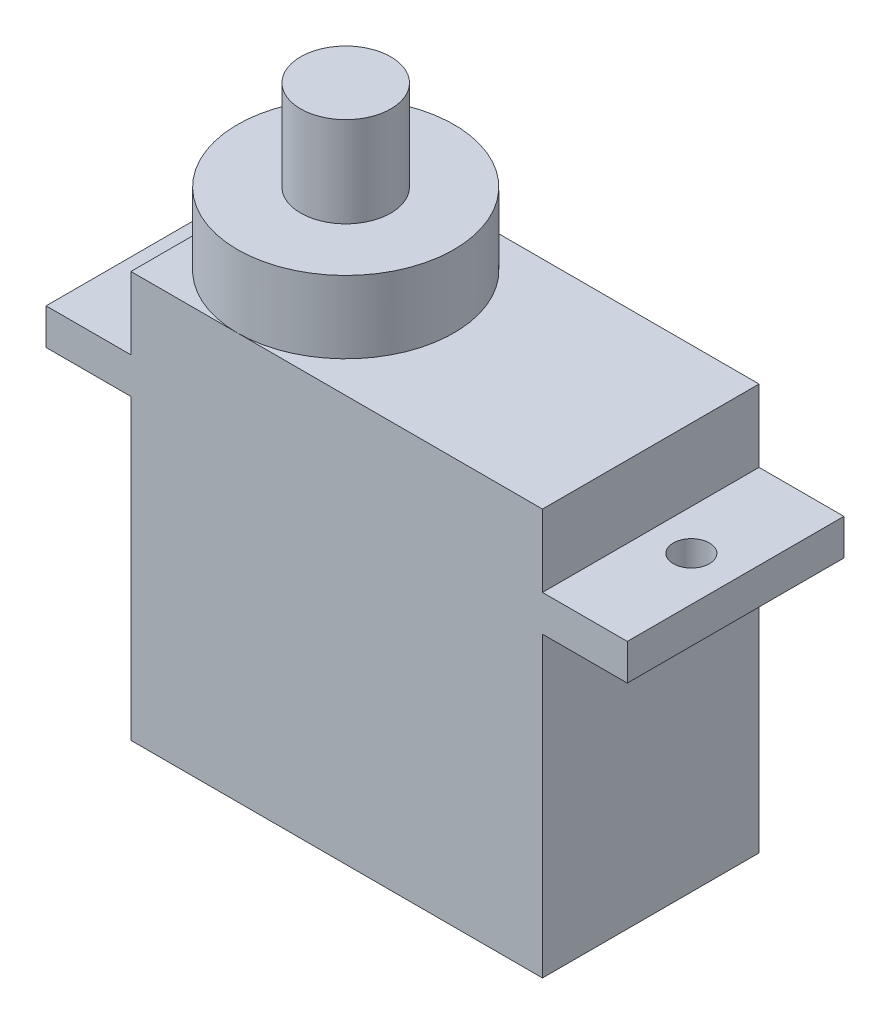
ISO-10303-21;
HEADER;
FILE_DESCRIPTION(('STEP AP214'),'2;1');
FILE_NAME('part.step','',(''),(''),'','','');
FILE_SCHEMA(('AUTOMOTIVE_DESIGN { 1 0 10303 214 1 1 1 1 }'));
ENDSEC;
DATA;
#1=APPLICATION_CONTEXT('core data for automotive mechanical design processes');
#2=APPLICATION_PROTOCOL_DEFINITION('international standard','automotive_design',2000,#1);
#3=PRODUCT_CONTEXT('',#1,'mechanical');
#4=PRODUCT('Part','Part','',(#3));
#5=PRODUCT_RELATED_PRODUCT_CATEGORY('part','',(#4));
#6=PRODUCT_DEFINITION_FORMATION('','',#4);
#7=PRODUCT_DEFINITION_CONTEXT('part definition',#1,'design');
#8=PRODUCT_DEFINITION('design','',#6,#7);
#9=PRODUCT_DEFINITION_SHAPE('','',#8);
#10=(LENGTH_UNIT() NAMED_UNIT(*) SI_UNIT(.MILLI.,.METRE.));
#11=(NAMED_UNIT(*) PLANE_ANGLE_UNIT() SI_UNIT($,.RADIAN.));
#12=(NAMED_UNIT(*) SI_UNIT($,.STERADIAN.) SOLID_ANGLE_UNIT());
#13=UNCERTAINTY_MEASURE_WITH_UNIT(LENGTH_MEASURE(1.E-05),#10,'distance_accuracy_value','');
#14=(GEOMETRIC_REPRESENTATION_CONTEXT(3) GLOBAL_UNCERTAINTY_ASSIGNED_CONTEXT((#13)) GLOBAL_UNIT_ASSIGNED_CONTEXT((#10,
#11,#12)) REPRESENTATION_CONTEXT('',''));
#15=CARTESIAN_POINT('',(0.,0.,0.));
#16=DIRECTION('',(0.,0.,1.));
#17=DIRECTION('',(1.,0.,0.));
#18=AXIS2_PLACEMENT_3D('',#15,#16,#17);
#19=CARTESIAN_POINT('',(0.,22.5,0.));
#20=DIRECTION('',(0.,-1.,0.));
#21=DIRECTION('',(0.,0.,-1.));
#22=AXIS2_PLACEMENT_3D('',#19,#20,#21);
#23=PLANE('',#22);
#24=CARTESIAN_POINT('',(-5.5,22.5,0.));
#25=DIRECTION('',(0.,1.,0.));
#26=DIRECTION('',(0.,0.,1.));
#27=AXIS2_PLACEMENT_3D('',#24,#25,#26);
#28=CIRCLE('',#27,6.);
#29=CARTESIAN_POINT('',(-5.5,22.5,-6.));
#30=VERTEX_POINT('',#29);
#31=CARTESIAN_POINT('',(-11.4,22.5,-1.09087121146357));
#32=VERTEX_POINT('',#31);
#33=EDGE_CURVE('E49',#30,#32,#28,.T.);
#34=ORIENTED_EDGE('',*,*,#33,.F.);
#35=DIRECTION('',(-1.,0.,0.));
#36=VECTOR('',#35,1.);
#37=CARTESIAN_POINT('',(-11.4,22.5,-6.));
#38=LINE('',#37,#36);
#39=CARTESIAN_POINT('',(-11.4,22.5,-6.));
#40=VERTEX_POINT('',#39);
#41=EDGE_CURVE('E262',#30,#40,#38,.T.);
#42=ORIENTED_EDGE('',*,*,#41,.T.);
#43=DIRECTION('',(0.,0.,1.));
#44=VECTOR('',#43,1.);
#45=CARTESIAN_POINT('',(-11.4,22.5,6.));
#46=LINE('',#45,#44);
#47=EDGE_CURVE('E163',#40,#32,#46,.T.);
#48=ORIENTED_EDGE('',*,*,#47,.T.);
#49=EDGE_LOOP('',(#34,#42,#48));
#50=FACE_BOUND('',#49,.T.);
#51=ADVANCED_FACE('F39',(#50),#23,.F.);
#52=CARTESIAN_POINT('',(-5.5,22.5,6.));
#53=VERTEX_POINT('',#52);
#54=EDGE_CURVE('E166',#53,#30,#28,.T.);
#55=ORIENTED_EDGE('',*,*,#54,.F.);
#56=DIRECTION('',(1.,0.,0.));
#57=VECTOR('',#56,1.);
#58=CARTESIAN_POINT('',(-11.4,22.5,6.));
#59=LINE('',#58,#57);
#60=CARTESIAN_POINT('',(11.4,22.5,6.));
#61=VERTEX_POINT('',#60);
#62=EDGE_CURVE('E151',#53,#61,#59,.T.);
#63=ORIENTED_EDGE('',*,*,#62,.T.);
#64=DIRECTION('',(0.,0.,-1.));
#65=VECTOR('',#64,1.);
#66=CARTESIAN_POINT('',(11.4,22.5,6.));
#67=LINE('',#66,#65);
#68=CARTESIAN_POINT('',(11.4,22.5,-6.));
#69=VERTEX_POINT('',#68);
#70=EDGE_CURVE('E259',#61,#69,#67,.T.);
#71=ORIENTED_EDGE('',*,*,#70,.T.);
#72=EDGE_CURVE('E168',#69,#30,#38,.T.);
#73=ORIENTED_EDGE('',*,*,#72,.T.);
#74=EDGE_LOOP('',(#55,#63,#71,#73));
#75=FACE_BOUND('',#74,.T.);
#76=ADVANCED_FACE('F167',(#75),#23,.F.);
#77=CARTESIAN_POINT('',(-11.4,22.5,6.));
#78=DIRECTION('',(1.,0.,0.));
#79=DIRECTION('',(0.,0.,-1.));
#80=AXIS2_PLACEMENT_3D('',#77,#78,#79);
#81=PLANE('',#80);
#82=DIRECTION('',(0.,-1.,0.));
#83=VECTOR('',#82,1.);
#84=CARTESIAN_POINT('',(-11.4,22.5,6.));
#85=LINE('',#84,#83);
#86=CARTESIAN_POINT('',(-11.4,16.5,6.));
#87=VERTEX_POINT('',#86);
#88=CARTESIAN_POINT('',(-11.4,0.,6.));
#89=VERTEX_POINT('',#88);
#90=EDGE_CURVE('E283',#87,#89,#85,.T.);
#91=ORIENTED_EDGE('',*,*,#90,.F.);
#92=DIRECTION('',(0.,0.,-1.));
#93=VECTOR('',#92,1.);
#94=CARTESIAN_POINT('',(-11.4,16.5,6.));
#95=LINE('',#94,#93);
#96=CARTESIAN_POINT('',(-11.4,16.5,-6.));
#97=VERTEX_POINT('',#96);
#98=EDGE_CURVE('E191',#87,#97,#95,.T.);
#99=ORIENTED_EDGE('',*,*,#98,.T.);
#100=DIRECTION('',(0.,-1.,0.));
#101=VECTOR('',#100,1.);
#102=CARTESIAN_POINT('',(-11.4,22.5,-6.));
#103=LINE('',#102,#101);
#104=CARTESIAN_POINT('',(-11.4,0.,-6.));
#105=VERTEX_POINT('',#104);
#106=EDGE_CURVE('E287',#97,#105,#103,.T.);
#107=ORIENTED_EDGE('',*,*,#106,.T.);
#108=DIRECTION('',(0.,0.,1.));
#109=VECTOR('',#108,1.);
#110=CARTESIAN_POINT('',(-11.4,0.,6.));
#111=LINE('',#110,#109);
#112=EDGE_CURVE('E275',#105,#89,#111,.T.);
#113=ORIENTED_EDGE('',*,*,#112,.T.);
#114=EDGE_LOOP('',(#91,#99,#107,#113));
#115=FACE_BOUND('',#114,.T.);
#116=ADVANCED_FACE('F297',(#115),#81,.F.);
#117=CARTESIAN_POINT('',(11.4,22.5,6.));
#118=DIRECTION('',(-1.,0.,0.));
#119=DIRECTION('',(0.,0.,1.));
#120=AXIS2_PLACEMENT_3D('',#117,#118,#119);
#121=PLANE('',#120);
#122=DIRECTION('',(0.,0.,1.));
#123=VECTOR('',#122,1.);
#124=CARTESIAN_POINT('',(11.4,18.5,6.));
#125=LINE('',#124,#123);
#126=CARTESIAN_POINT('',(11.4,18.5,-6.));
#127=VERTEX_POINT('',#126);
#128=CARTESIAN_POINT('',(11.4,18.5,6.));
#129=VERTEX_POINT('',#128);
#130=EDGE_CURVE('E228',#127,#129,#125,.T.);
#131=ORIENTED_EDGE('',*,*,#130,.F.);
#132=DIRECTION('',(0.,-1.,0.));
#133=VECTOR('',#132,1.);
#134=CARTESIAN_POINT('',(11.4,22.5,-6.));
#135=LINE('',#134,#133);
#136=EDGE_CURVE('E179',#69,#127,#135,.T.);
#137=ORIENTED_EDGE('',*,*,#136,.F.);
#138=ORIENTED_EDGE('',*,*,#70,.F.);
#139=DIRECTION('',(0.,-1.,0.));
#140=VECTOR('',#139,1.);
#141=CARTESIAN_POINT('',(11.4,22.5,6.));
#142=LINE('',#141,#140);
#143=EDGE_CURVE('E158',#61,#129,#142,.T.);
#144=ORIENTED_EDGE('',*,*,#143,.T.);
#145=EDGE_LOOP('',(#131,#137,#138,#144));
#146=FACE_BOUND('',#145,.T.);
#147=ADVANCED_FACE('F41',(#146),#121,.F.);
#148=DIRECTION('',(0.,0.,-1.));
#149=VECTOR('',#148,1.);
#150=CARTESIAN_POINT('',(11.4,16.5,6.));
#151=LINE('',#150,#149);
#152=CARTESIAN_POINT('',(11.4,16.5,6.));
#153=VERTEX_POINT('',#152);
#154=CARTESIAN_POINT('',(11.4,16.5,-6.));
#155=VERTEX_POINT('',#154);
#156=EDGE_CURVE('E222',#153,#155,#151,.T.);
#157=ORIENTED_EDGE('',*,*,#156,.F.);
#158=CARTESIAN_POINT('',(11.4,0.,6.));
#159=VERTEX_POINT('',#158);
#160=EDGE_CURVE('E150',#153,#159,#142,.T.);
#161=ORIENTED_EDGE('',*,*,#160,.T.);
#162=DIRECTION('',(0.,0.,-1.));
#163=VECTOR('',#162,1.);
#164=CARTESIAN_POINT('',(11.4,0.,6.));
#165=LINE('',#164,#163);
#166=CARTESIAN_POINT('',(11.4,0.,-6.));
#167=VERTEX_POINT('',#166);
#168=EDGE_CURVE('E258',#159,#167,#165,.T.);
#169=ORIENTED_EDGE('',*,*,#168,.T.);
#170=EDGE_CURVE('E183',#155,#167,#135,.T.);
#171=ORIENTED_EDGE('',*,*,#170,.F.);
#172=EDGE_LOOP('',(#157,#161,#169,#171));
#173=FACE_BOUND('',#172,.T.);
#174=ADVANCED_FACE('F373',(#173),#121,.F.);
#175=CARTESIAN_POINT('',(-11.4,22.5,-6.));
#176=DIRECTION('',(0.,0.,1.));
#177=DIRECTION('',(1.,0.,0.));
#178=AXIS2_PLACEMENT_3D('',#175,#176,#177);
#179=PLANE('',#178);
#180=DIRECTION('',(-1.,0.,0.));
#181=VECTOR('',#180,1.);
#182=CARTESIAN_POINT('',(-11.4,0.,-6.));
#183=LINE('',#182,#181);
#184=EDGE_CURVE('E271',#167,#105,#183,.T.);
#185=ORIENTED_EDGE('',*,*,#184,.T.);
#186=ORIENTED_EDGE('',*,*,#106,.F.);
#187=DIRECTION('',(1.,0.,0.));
#188=VECTOR('',#187,1.);
#189=CARTESIAN_POINT('',(-16.1,16.5,-6.));
#190=LINE('',#189,#188);
#191=CARTESIAN_POINT('',(-16.1,16.5,-6.));
#192=VERTEX_POINT('',#191);
#193=EDGE_CURVE('E213',#192,#97,#190,.T.);
#194=ORIENTED_EDGE('',*,*,#193,.F.);
#195=DIRECTION('',(0.,1.,0.));
#196=VECTOR('',#195,1.);
#197=CARTESIAN_POINT('',(-16.1,18.5,-6.));
#198=LINE('',#197,#196);
#199=CARTESIAN_POINT('',(-16.1,18.5,-6.));
#200=VERTEX_POINT('',#199);
#201=EDGE_CURVE('E195',#192,#200,#198,.T.);
#202=ORIENTED_EDGE('',*,*,#201,.T.);
#203=DIRECTION('',(1.,0.,0.));
#204=VECTOR('',#203,1.);
#205=CARTESIAN_POINT('',(-16.1,18.5,-6.));
#206=LINE('',#205,#204);
#207=CARTESIAN_POINT('',(-11.4,18.5,-6.));
#208=VERTEX_POINT('',#207);
#209=EDGE_CURVE('E216',#200,#208,#206,.T.);
#210=ORIENTED_EDGE('',*,*,#209,.T.);
#211=EDGE_CURVE('E288',#40,#208,#103,.T.);
#212=ORIENTED_EDGE('',*,*,#211,.F.);
#213=ORIENTED_EDGE('',*,*,#41,.F.);
#214=ORIENTED_EDGE('',*,*,#72,.F.);
#215=ORIENTED_EDGE('',*,*,#136,.T.);
#216=DIRECTION('',(-1.,0.,0.));
#217=VECTOR('',#216,1.);
#218=CARTESIAN_POINT('',(16.1,18.5,-6.));
#219=LINE('',#218,#217);
#220=CARTESIAN_POINT('',(16.1,18.5,-6.));
#221=VERTEX_POINT('',#220);
#222=EDGE_CURVE('E246',#221,#127,#219,.T.);
#223=ORIENTED_EDGE('',*,*,#222,.F.);
#224=DIRECTION('',(0.,1.,0.));
#225=VECTOR('',#224,1.);
#226=CARTESIAN_POINT('',(16.1,18.5,-6.));
#227=LINE('',#226,#225);
#228=CARTESIAN_POINT('',(16.1,16.5,-6.));
#229=VERTEX_POINT('',#228);
#230=EDGE_CURVE('E231',#229,#221,#227,.T.);
#231=ORIENTED_EDGE('',*,*,#230,.F.);
#232=DIRECTION('',(-1.,0.,0.));
#233=VECTOR('',#232,1.);
#234=CARTESIAN_POINT('',(16.1,16.5,-6.));
#235=LINE('',#234,#233);
#236=EDGE_CURVE('E250',#229,#155,#235,.T.);
#237=ORIENTED_EDGE('',*,*,#236,.T.);
#238=ORIENTED_EDGE('',*,*,#170,.T.);
#239=EDGE_LOOP('',(#185,#186,#194,#202,#210,#212,#213,#214,#215,#223,#231,#237,#238));
#240=FACE_BOUND('',#239,.T.);
#241=ADVANCED_FACE('F303',(#240),#179,.F.);
#242=ORIENTED_EDGE('',*,*,#211,.T.);
#243=DIRECTION('',(0.,0.,1.));
#244=VECTOR('',#243,1.);
#245=CARTESIAN_POINT('',(-11.4,18.5,6.));
#246=LINE('',#245,#244);
#247=CARTESIAN_POINT('',(-11.4,18.5,6.));
#248=VERTEX_POINT('',#247);
#249=EDGE_CURVE('E204',#208,#248,#246,.T.);
#250=ORIENTED_EDGE('',*,*,#249,.T.);
#251=CARTESIAN_POINT('',(-11.4,22.5,6.));
#252=VERTEX_POINT('',#251);
#253=EDGE_CURVE('E284',#252,#248,#85,.T.);
#254=ORIENTED_EDGE('',*,*,#253,.F.);
#255=CARTESIAN_POINT('',(-11.4,22.5,1.09087121146357));
#256=VERTEX_POINT('',#255);
#257=EDGE_CURVE('E145',#256,#252,#46,.T.);
#258=ORIENTED_EDGE('',*,*,#257,.F.);
#259=EDGE_CURVE('E64',#32,#256,#46,.T.);
#260=ORIENTED_EDGE('',*,*,#259,.F.);
#261=ORIENTED_EDGE('',*,*,#47,.F.);
#262=EDGE_LOOP('',(#242,#250,#254,#258,#260,#261));
#263=FACE_BOUND('',#262,.T.);
#264=ADVANCED_FACE('F366',(#263),#81,.F.);
#265=CARTESIAN_POINT('',(-11.4,22.5,6.));
#266=DIRECTION('',(0.,0.,-1.));
#267=DIRECTION('',(-1.,0.,0.));
#268=AXIS2_PLACEMENT_3D('',#265,#266,#267);
#269=PLANE('',#268);
#270=DIRECTION('',(1.,0.,0.));
#271=VECTOR('',#270,1.);
#272=CARTESIAN_POINT('',(-11.4,0.,6.));
#273=LINE('',#272,#271);
#274=EDGE_CURVE('E263',#89,#159,#273,.T.);
#275=ORIENTED_EDGE('',*,*,#274,.T.);
#276=ORIENTED_EDGE('',*,*,#160,.F.);
#277=DIRECTION('',(-1.,0.,0.));
#278=VECTOR('',#277,1.);
#279=CARTESIAN_POINT('',(16.1,16.5,6.));
#280=LINE('',#279,#278);
#281=CARTESIAN_POINT('',(16.1,16.5,6.));
#282=VERTEX_POINT('',#281);
#283=EDGE_CURVE('E254',#282,#153,#280,.T.);
#284=ORIENTED_EDGE('',*,*,#283,.F.);
#285=DIRECTION('',(0.,-1.,0.));
#286=VECTOR('',#285,1.);
#287=CARTESIAN_POINT('',(16.1,18.5,6.));
#288=LINE('',#287,#286);
#289=CARTESIAN_POINT('',(16.1,18.5,6.));
#290=VERTEX_POINT('',#289);
#291=EDGE_CURVE('E223',#290,#282,#288,.T.);
#292=ORIENTED_EDGE('',*,*,#291,.F.);
#293=DIRECTION('',(-1.,0.,0.));
#294=VECTOR('',#293,1.);
#295=CARTESIAN_POINT('',(16.1,18.5,6.));
#296=LINE('',#295,#294);
#297=EDGE_CURVE('E237',#290,#129,#296,.T.);
#298=ORIENTED_EDGE('',*,*,#297,.T.);
#299=ORIENTED_EDGE('',*,*,#143,.F.);
#300=ORIENTED_EDGE('',*,*,#62,.F.);
#301=EDGE_CURVE('E142',#252,#53,#59,.T.);
#302=ORIENTED_EDGE('',*,*,#301,.F.);
#303=ORIENTED_EDGE('',*,*,#253,.T.);
#304=DIRECTION('',(1.,0.,0.));
#305=VECTOR('',#304,1.);
#306=CARTESIAN_POINT('',(-16.1,18.5,6.));
#307=LINE('',#306,#305);
#308=CARTESIAN_POINT('',(-16.1,18.5,6.));
#309=VERTEX_POINT('',#308);
#310=EDGE_CURVE('E219',#309,#248,#307,.T.);
#311=ORIENTED_EDGE('',*,*,#310,.F.);
#312=DIRECTION('',(0.,-1.,0.));
#313=VECTOR('',#312,1.);
#314=CARTESIAN_POINT('',(-16.1,18.5,6.));
#315=LINE('',#314,#313);
#316=CARTESIAN_POINT('',(-16.1,16.5,6.));
#317=VERTEX_POINT('',#316);
#318=EDGE_CURVE('E186',#309,#317,#315,.T.);
#319=ORIENTED_EDGE('',*,*,#318,.T.);
#320=DIRECTION('',(1.,0.,0.));
#321=VECTOR('',#320,1.);
#322=CARTESIAN_POINT('',(-16.1,16.5,6.));
#323=LINE('',#322,#321);
#324=EDGE_CURVE('E203',#317,#87,#323,.T.);
#325=ORIENTED_EDGE('',*,*,#324,.T.);
#326=ORIENTED_EDGE('',*,*,#90,.T.);
#327=EDGE_LOOP('',(#275,#276,#284,#292,#298,#299,#300,#302,#303,#311,#319,#325,#326));
#328=FACE_BOUND('',#327,.T.);
#329=ADVANCED_FACE('F156',(#328),#269,.F.);
#330=EDGE_CURVE('E57',#256,#53,#28,.T.);
#331=ORIENTED_EDGE('',*,*,#330,.F.);
#332=ORIENTED_EDGE('',*,*,#257,.T.);
#333=ORIENTED_EDGE('',*,*,#301,.T.);
#334=EDGE_LOOP('',(#331,#332,#333));
#335=FACE_BOUND('',#334,.T.);
#336=ADVANCED_FACE('F144',(#335),#23,.F.);
#337=CARTESIAN_POINT('',(0.,0.,0.));
#338=DIRECTION('',(0.,-1.,0.));
#339=DIRECTION('',(0.,0.,-1.));
#340=AXIS2_PLACEMENT_3D('',#337,#338,#339);
#341=PLANE('',#340);
#342=ORIENTED_EDGE('',*,*,#168,.F.);
#343=ORIENTED_EDGE('',*,*,#274,.F.);
#344=ORIENTED_EDGE('',*,*,#112,.F.);
#345=ORIENTED_EDGE('',*,*,#184,.F.);
#346=EDGE_LOOP('',(#342,#343,#344,#345));
#347=FACE_BOUND('',#346,.T.);
#348=ADVANCED_FACE('F306',(#347),#341,.T.);
#349=CARTESIAN_POINT('',(16.1,16.5,6.));
#350=DIRECTION('',(0.,1.,0.));
#351=DIRECTION('',(0.,0.,1.));
#352=AXIS2_PLACEMENT_3D('',#349,#350,#351);
#353=PLANE('',#352);
#354=CARTESIAN_POINT('',(13.65,16.5,0.));
#355=DIRECTION('',(0.,1.,0.));
#356=DIRECTION('',(0.,0.,1.));
#357=AXIS2_PLACEMENT_3D('',#354,#355,#356);
#358=CIRCLE('',#357,1.);
#359=CARTESIAN_POINT('',(13.65,16.5,1.));
#360=VERTEX_POINT('',#359);
#361=EDGE_CURVE('E321',#360,#360,#358,.T.);
#362=ORIENTED_EDGE('',*,*,#361,.T.);
#363=EDGE_LOOP('',(#362));
#364=FACE_BOUND('',#363,.T.);
#365=ORIENTED_EDGE('',*,*,#156,.T.);
#366=ORIENTED_EDGE('',*,*,#236,.F.);
#367=DIRECTION('',(0.,0.,-1.));
#368=VECTOR('',#367,1.);
#369=CARTESIAN_POINT('',(16.1,16.5,6.));
#370=LINE('',#369,#368);
#371=EDGE_CURVE('E227',#282,#229,#370,.T.);
#372=ORIENTED_EDGE('',*,*,#371,.F.);
#373=ORIENTED_EDGE('',*,*,#283,.T.);
#374=EDGE_LOOP('',(#365,#366,#372,#373));
#375=FACE_BOUND('',#374,.T.);
#376=ADVANCED_FACE('F365',(#364,#375),#353,.F.);
#377=CARTESIAN_POINT('',(16.1,18.5,6.));
#378=DIRECTION('',(0.,-1.,0.));
#379=DIRECTION('',(0.,0.,-1.));
#380=AXIS2_PLACEMENT_3D('',#377,#378,#379);
#381=PLANE('',#380);
#382=CARTESIAN_POINT('',(13.65,18.5,0.));
#383=DIRECTION('',(0.,1.,0.));
#384=DIRECTION('',(0.,0.,1.));
#385=AXIS2_PLACEMENT_3D('',#382,#383,#384);
#386=CIRCLE('',#385,1.);
#387=CARTESIAN_POINT('',(13.65,18.5,1.));
#388=VERTEX_POINT('',#387);
#389=EDGE_CURVE('E325',#388,#388,#386,.T.);
#390=ORIENTED_EDGE('',*,*,#389,.F.);
#391=EDGE_LOOP('',(#390));
#392=FACE_BOUND('',#391,.T.);
#393=ORIENTED_EDGE('',*,*,#130,.T.);
#394=ORIENTED_EDGE('',*,*,#297,.F.);
#395=DIRECTION('',(0.,0.,1.));
#396=VECTOR('',#395,1.);
#397=CARTESIAN_POINT('',(16.1,18.5,6.));
#398=LINE('',#397,#396);
#399=EDGE_CURVE('E234',#221,#290,#398,.T.);
#400=ORIENTED_EDGE('',*,*,#399,.F.);
#401=ORIENTED_EDGE('',*,*,#222,.T.);
#402=EDGE_LOOP('',(#393,#394,#400,#401));
#403=FACE_BOUND('',#402,.T.);
#404=ADVANCED_FACE('F392',(#392,#403),#381,.F.);
#405=CARTESIAN_POINT('',(16.1,0.,0.));
#406=DIRECTION('',(1.,0.,0.));
#407=DIRECTION('',(0.,0.,-1.));
#408=AXIS2_PLACEMENT_3D('',#405,#406,#407);
#409=PLANE('',#408);
#410=ORIENTED_EDGE('',*,*,#291,.T.);
#411=ORIENTED_EDGE('',*,*,#371,.T.);
#412=ORIENTED_EDGE('',*,*,#230,.T.);
#413=ORIENTED_EDGE('',*,*,#399,.T.);
#414=EDGE_LOOP('',(#410,#411,#412,#413));
#415=FACE_BOUND('',#414,.T.);
#416=ADVANCED_FACE('F388',(#415),#409,.T.);
#417=CARTESIAN_POINT('',(-16.1,18.5,6.));
#418=DIRECTION('',(0.,1.,0.));
#419=DIRECTION('',(0.,0.,1.));
#420=AXIS2_PLACEMENT_3D('',#417,#418,#419);
#421=PLANE('',#420);
#422=CARTESIAN_POINT('',(-13.65,18.5,0.));
#423=DIRECTION('',(0.,-1.,0.));
#424=DIRECTION('',(0.,0.,1.));
#425=AXIS2_PLACEMENT_3D('',#422,#423,#424);
#426=CIRCLE('',#425,1.);
#427=CARTESIAN_POINT('',(-13.65,18.5,1.));
#428=VERTEX_POINT('',#427);
#429=EDGE_CURVE('E332',#428,#428,#426,.T.);
#430=ORIENTED_EDGE('',*,*,#429,.T.);
#431=EDGE_LOOP('',(#430));
#432=FACE_BOUND('',#431,.T.);
#433=ORIENTED_EDGE('',*,*,#249,.F.);
#434=ORIENTED_EDGE('',*,*,#209,.F.);
#435=DIRECTION('',(0.,0.,1.));
#436=VECTOR('',#435,1.);
#437=CARTESIAN_POINT('',(-16.1,18.5,6.));
#438=LINE('',#437,#436);
#439=EDGE_CURVE('E190',#200,#309,#438,.T.);
#440=ORIENTED_EDGE('',*,*,#439,.T.);
#441=ORIENTED_EDGE('',*,*,#310,.T.);
#442=EDGE_LOOP('',(#433,#434,#440,#441));
#443=FACE_BOUND('',#442,.T.);
#444=ADVANCED_FACE('F337',(#432,#443),#421,.T.);
#445=CARTESIAN_POINT('',(-16.1,16.5,6.));
#446=DIRECTION('',(0.,-1.,0.));
#447=DIRECTION('',(0.,0.,-1.));
#448=AXIS2_PLACEMENT_3D('',#445,#446,#447);
#449=PLANE('',#448);
#450=CARTESIAN_POINT('',(-13.65,16.5,0.));
#451=DIRECTION('',(0.,-1.,0.));
#452=DIRECTION('',(0.,0.,-1.));
#453=AXIS2_PLACEMENT_3D('',#450,#451,#452);
#454=CIRCLE('',#453,1.);
#455=CARTESIAN_POINT('',(-13.65,16.5,-1.));
#456=VERTEX_POINT('',#455);
#457=EDGE_CURVE('E43',#456,#456,#454,.F.);
#458=ORIENTED_EDGE('',*,*,#457,.T.);
#459=EDGE_LOOP('',(#458));
#460=FACE_BOUND('',#459,.T.);
#461=ORIENTED_EDGE('',*,*,#98,.F.);
#462=ORIENTED_EDGE('',*,*,#324,.F.);
#463=DIRECTION('',(0.,0.,-1.));
#464=VECTOR('',#463,1.);
#465=CARTESIAN_POINT('',(-16.1,16.5,6.));
#466=LINE('',#465,#464);
#467=EDGE_CURVE('E199',#317,#192,#466,.T.);
#468=ORIENTED_EDGE('',*,*,#467,.T.);
#469=ORIENTED_EDGE('',*,*,#193,.T.);
#470=EDGE_LOOP('',(#461,#462,#468,#469));
#471=FACE_BOUND('',#470,.T.);
#472=ADVANCED_FACE('F407',(#460,#471),#449,.T.);
#473=CARTESIAN_POINT('',(-16.1,0.,0.));
#474=DIRECTION('',(-1.,0.,0.));
#475=DIRECTION('',(0.,0.,-1.));
#476=AXIS2_PLACEMENT_3D('',#473,#474,#475);
#477=PLANE('',#476);
#478=ORIENTED_EDGE('',*,*,#318,.F.);
#479=ORIENTED_EDGE('',*,*,#439,.F.);
#480=ORIENTED_EDGE('',*,*,#201,.F.);
#481=ORIENTED_EDGE('',*,*,#467,.F.);
#482=EDGE_LOOP('',(#478,#479,#480,#481));
#483=FACE_BOUND('',#482,.T.);
#484=ADVANCED_FACE('F398',(#483),#477,.T.);
#485=CARTESIAN_POINT('',(-5.5,22.5,0.));
#486=DIRECTION('',(0.,1.,0.));
#487=DIRECTION('',(0.,0.,1.));
#488=AXIS2_PLACEMENT_3D('',#485,#486,#487);
#489=PLANE('',#488);
#490=EDGE_CURVE('E173',#32,#256,#28,.T.);
#491=ORIENTED_EDGE('',*,*,#490,.F.);
#492=ORIENTED_EDGE('',*,*,#259,.T.);
#493=EDGE_LOOP('',(#491,#492));
#494=FACE_BOUND('',#493,.T.);
#495=ADVANCED_FACE('F396',(#494),#489,.F.);
#496=CARTESIAN_POINT('',(-5.5,26.5,0.));
#497=DIRECTION('',(0.,-1.,0.));
#498=DIRECTION('',(0.,0.,-1.));
#499=AXIS2_PLACEMENT_3D('',#496,#497,#498);
#500=CYLINDRICAL_SURFACE('',#499,6.);
#501=CARTESIAN_POINT('',(-5.5,26.5,0.));
#502=DIRECTION('',(0.,1.,0.));
#503=DIRECTION('',(0.,0.,1.));
#504=AXIS2_PLACEMENT_3D('',#501,#502,#503);
#505=CIRCLE('',#504,6.);
#506=CARTESIAN_POINT('',(-5.5,26.5,6.));
#507=VERTEX_POINT('',#506);
#508=EDGE_CURVE('E172',#507,#507,#505,.T.);
#509=ORIENTED_EDGE('',*,*,#508,.F.);
#510=EDGE_LOOP('',(#509));
#511=FACE_BOUND('',#510,.T.);
#512=ORIENTED_EDGE('',*,*,#54,.T.);
#513=ORIENTED_EDGE('',*,*,#33,.T.);
#514=ORIENTED_EDGE('',*,*,#490,.T.);
#515=ORIENTED_EDGE('',*,*,#330,.T.);
#516=EDGE_LOOP('',(#512,#513,#514,#515));
#517=FACE_BOUND('',#516,.T.);
#518=ADVANCED_FACE('F176',(#511,#517),#500,.T.);
#519=CARTESIAN_POINT('',(-5.5,26.5,0.));
#520=DIRECTION('',(0.,1.,0.));
#521=DIRECTION('',(0.,0.,1.));
#522=AXIS2_PLACEMENT_3D('',#519,#520,#521);
#523=PLANE('',#522);
#524=CARTESIAN_POINT('',(-5.5,26.5,0.));
#525=DIRECTION('',(0.,1.,0.));
#526=DIRECTION('',(0.,0.,1.));
#527=AXIS2_PLACEMENT_3D('',#524,#525,#526);
#528=CIRCLE('',#527,2.5);
#529=CARTESIAN_POINT('',(-5.5,26.5,2.5));
#530=VERTEX_POINT('',#529);
#531=EDGE_CURVE('E11',#530,#530,#528,.T.);
#532=ORIENTED_EDGE('',*,*,#531,.F.);
#533=EDGE_LOOP('',(#532));
#534=FACE_BOUND('',#533,.T.);
#535=ORIENTED_EDGE('',*,*,#508,.T.);
#536=EDGE_LOOP('',(#535));
#537=FACE_BOUND('',#536,.T.);
#538=ADVANCED_FACE('F404',(#534,#537),#523,.T.);
#539=CARTESIAN_POINT('',(-5.5,31.5,0.));
#540=DIRECTION('',(0.,-1.,0.));
#541=DIRECTION('',(0.,0.,-1.));
#542=AXIS2_PLACEMENT_3D('',#539,#540,#541);
#543=CYLINDRICAL_SURFACE('',#542,2.5);
#544=CARTESIAN_POINT('',(-5.5,31.5,0.));
#545=DIRECTION('',(0.,1.,0.));
#546=DIRECTION('',(0.,0.,1.));
#547=AXIS2_PLACEMENT_3D('',#544,#545,#546);
#548=CIRCLE('',#547,2.5);
#549=CARTESIAN_POINT('',(-5.5,31.5,2.5));
#550=VERTEX_POINT('',#549);
#551=EDGE_CURVE('E318',#550,#550,#548,.T.);
#552=ORIENTED_EDGE('',*,*,#551,.F.);
#553=EDGE_LOOP('',(#552));
#554=FACE_BOUND('',#553,.T.);
#555=ORIENTED_EDGE('',*,*,#531,.T.);
#556=EDGE_LOOP('',(#555));
#557=FACE_BOUND('',#556,.T.);
#558=ADVANCED_FACE('F508',(#554,#557),#543,.T.);
#559=CARTESIAN_POINT('',(-5.5,31.5,0.));
#560=DIRECTION('',(0.,1.,0.));
#561=DIRECTION('',(0.,0.,1.));
#562=AXIS2_PLACEMENT_3D('',#559,#560,#561);
#563=PLANE('',#562);
#564=ORIENTED_EDGE('',*,*,#551,.T.);
#565=EDGE_LOOP('',(#564));
#566=FACE_BOUND('',#565,.T.);
#567=ADVANCED_FACE('F348',(#566),#563,.T.);
#568=CARTESIAN_POINT('',(13.65,13.5,0.));
#569=DIRECTION('',(0.,1.,0.));
#570=DIRECTION('',(0.,0.,1.));
#571=AXIS2_PLACEMENT_3D('',#568,#569,#570);
#572=CYLINDRICAL_SURFACE('',#571,1.);
#573=ORIENTED_EDGE('',*,*,#389,.T.);
#574=EDGE_LOOP('',(#573));
#575=FACE_BOUND('',#574,.T.);
#576=ORIENTED_EDGE('',*,*,#361,.F.);
#577=EDGE_LOOP('',(#576));
#578=FACE_BOUND('',#577,.T.);
#579=ADVANCED_FACE('F342',(#575,#578),#572,.F.);
#580=CARTESIAN_POINT('',(-13.65,13.5,0.));
#581=DIRECTION('',(0.,1.,0.));
#582=DIRECTION('',(0.,0.,1.));
#583=AXIS2_PLACEMENT_3D('',#580,#581,#582);
#584=CYLINDRICAL_SURFACE('',#583,1.);
#585=ORIENTED_EDGE('',*,*,#457,.F.);
#586=EDGE_LOOP('',(#585));
#587=FACE_BOUND('',#586,.T.);
#588=ORIENTED_EDGE('',*,*,#429,.F.);
#589=EDGE_LOOP('',(#588));
#590=FACE_BOUND('',#589,.T.);
#591=ADVANCED_FACE('F340',(#587,#590),#584,.F.);
#592=CLOSED_SHELL('',(#51,#76,#116,#147,#174,#241,#264,#329,#336,#348,#376,#404,#416,#444,#472,
#484,#495,#518,#538,#558,#567,#579,#591));
#593=MANIFOLD_SOLID_BREP('B2',#592);
#594=ADVANCED_BREP_SHAPE_REPRESENTATION('',(#18,#593),#14);
#595=SHAPE_DEFINITION_REPRESENTATION(#9,#594);
ENDSEC;
END-ISO-10303-21;
